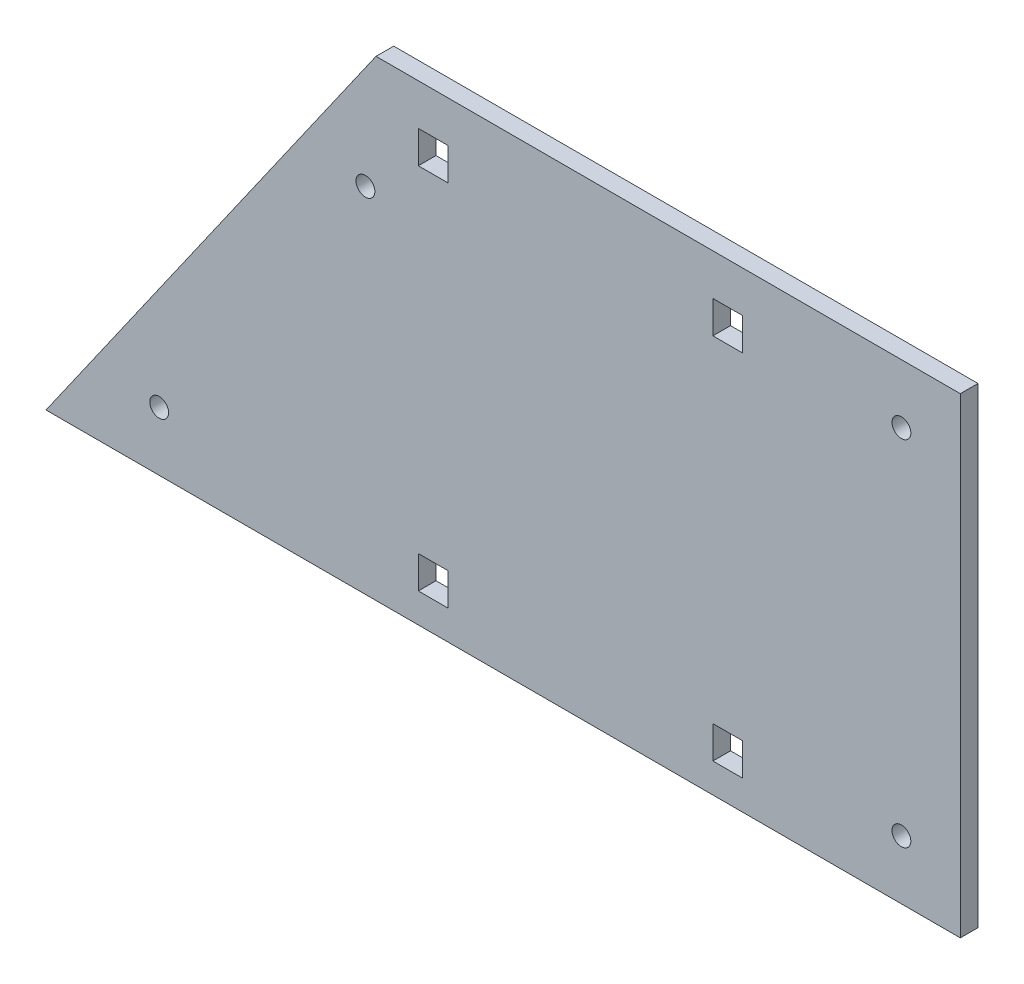
ISO-10303-21;
HEADER;
FILE_DESCRIPTION(('STEP AP214'),'2;1');
FILE_NAME('part.step','',(''),(''),'','','');
FILE_SCHEMA(('AUTOMOTIVE_DESIGN { 1 0 10303 214 1 1 1 1 }'));
ENDSEC;
DATA;
#1=APPLICATION_CONTEXT('core data for automotive mechanical design processes');
#2=APPLICATION_PROTOCOL_DEFINITION('international standard','automotive_design',2000,#1);
#3=PRODUCT_CONTEXT('',#1,'mechanical');
#4=PRODUCT('Part','Part','',(#3));
#5=PRODUCT_RELATED_PRODUCT_CATEGORY('part','',(#4));
#6=PRODUCT_DEFINITION_FORMATION('','',#4);
#7=PRODUCT_DEFINITION_CONTEXT('part definition',#1,'design');
#8=PRODUCT_DEFINITION('design','',#6,#7);
#9=PRODUCT_DEFINITION_SHAPE('','',#8);
#10=(LENGTH_UNIT() NAMED_UNIT(*) SI_UNIT(.MILLI.,.METRE.));
#11=(NAMED_UNIT(*) PLANE_ANGLE_UNIT() SI_UNIT($,.RADIAN.));
#12=(NAMED_UNIT(*) SI_UNIT($,.STERADIAN.) SOLID_ANGLE_UNIT());
#13=UNCERTAINTY_MEASURE_WITH_UNIT(LENGTH_MEASURE(1.E-05),#10,'distance_accuracy_value','');
#14=(GEOMETRIC_REPRESENTATION_CONTEXT(3) GLOBAL_UNCERTAINTY_ASSIGNED_CONTEXT((#13)) GLOBAL_UNIT_ASSIGNED_CONTEXT((#10,
#11,#12)) REPRESENTATION_CONTEXT('',''));
#15=CARTESIAN_POINT('',(0.,0.,0.));
#16=DIRECTION('',(0.,0.,1.));
#17=DIRECTION('',(1.,0.,0.));
#18=AXIS2_PLACEMENT_3D('',#15,#16,#17);
#19=CARTESIAN_POINT('',(0.,0.,3.));
#20=DIRECTION('',(0.,0.,1.));
#21=DIRECTION('',(1.,0.,0.));
#22=AXIS2_PLACEMENT_3D('',#19,#20,#21);
#23=PLANE('',#22);
#24=DIRECTION('',(0.,1.,0.));
#25=VECTOR('',#24,1.);
#26=CARTESIAN_POINT('',(100.749999999974,-37.7500110166151,3.));
#27=LINE('',#26,#25);
#28=CARTESIAN_POINT('',(100.749999999974,-37.7500110166151,3.));
#29=VERTEX_POINT('',#28);
#30=CARTESIAN_POINT('',(100.749999999974,-32.2500110166151,3.));
#31=VERTEX_POINT('',#30);
#32=EDGE_CURVE('E49',#29,#31,#27,.T.);
#33=ORIENTED_EDGE('',*,*,#32,.F.);
#34=DIRECTION('',(1.,0.,0.));
#35=VECTOR('',#34,1.);
#36=CARTESIAN_POINT('',(100.749999999974,-37.7500110166151,3.));
#37=LINE('',#36,#35);
#38=CARTESIAN_POINT('',(95.7499999999737,-37.7500110166151,3.));
#39=VERTEX_POINT('',#38);
#40=EDGE_CURVE('E194',#39,#29,#37,.T.);
#41=ORIENTED_EDGE('',*,*,#40,.F.);
#42=DIRECTION('',(0.,-1.,0.));
#43=VECTOR('',#42,1.);
#44=CARTESIAN_POINT('',(95.7499999999737,-37.7500110166151,3.));
#45=LINE('',#44,#43);
#46=CARTESIAN_POINT('',(95.7499999999737,-32.2500110166151,3.));
#47=VERTEX_POINT('',#46);
#48=EDGE_CURVE('E178',#47,#39,#45,.T.);
#49=ORIENTED_EDGE('',*,*,#48,.F.);
#50=DIRECTION('',(-1.,0.,0.));
#51=VECTOR('',#50,1.);
#52=CARTESIAN_POINT('',(100.749999999974,-32.2500110166151,3.));
#53=LINE('',#52,#51);
#54=EDGE_CURVE('E188',#31,#47,#53,.T.);
#55=ORIENTED_EDGE('',*,*,#54,.F.);
#56=EDGE_LOOP('',(#33,#41,#49,#55));
#57=FACE_BOUND('',#56,.T.);
#58=DIRECTION('',(0.,1.,0.));
#59=VECTOR('',#58,1.);
#60=CARTESIAN_POINT('',(50.7499999999734,-37.750011016615,3.));
#61=LINE('',#60,#59);
#62=CARTESIAN_POINT('',(50.7499999999734,-37.750011016615,3.));
#63=VERTEX_POINT('',#62);
#64=CARTESIAN_POINT('',(50.7499999999734,-32.250011016615,3.));
#65=VERTEX_POINT('',#64);
#66=EDGE_CURVE('E57',#63,#65,#61,.T.);
#67=ORIENTED_EDGE('',*,*,#66,.F.);
#68=DIRECTION('',(1.,0.,0.));
#69=VECTOR('',#68,1.);
#70=CARTESIAN_POINT('',(50.7499999999734,-37.750011016615,3.));
#71=LINE('',#70,#69);
#72=CARTESIAN_POINT('',(45.7499999999735,-37.750011016615,3.));
#73=VERTEX_POINT('',#72);
#74=EDGE_CURVE('E211',#73,#63,#71,.T.);
#75=ORIENTED_EDGE('',*,*,#74,.F.);
#76=DIRECTION('',(0.,-1.,0.));
#77=VECTOR('',#76,1.);
#78=CARTESIAN_POINT('',(45.7499999999735,-37.750011016615,3.));
#79=LINE('',#78,#77);
#80=CARTESIAN_POINT('',(45.7499999999735,-32.250011016615,3.));
#81=VERTEX_POINT('',#80);
#82=EDGE_CURVE('E208',#81,#73,#79,.T.);
#83=ORIENTED_EDGE('',*,*,#82,.F.);
#84=DIRECTION('',(-1.,0.,0.));
#85=VECTOR('',#84,1.);
#86=CARTESIAN_POINT('',(50.7499999999734,-32.250011016615,3.));
#87=LINE('',#86,#85);
#88=EDGE_CURVE('E205',#65,#81,#87,.T.);
#89=ORIENTED_EDGE('',*,*,#88,.F.);
#90=EDGE_LOOP('',(#67,#75,#83,#89));
#91=FACE_BOUND('',#90,.T.);
#92=DIRECTION('',(0.,1.,0.));
#93=VECTOR('',#92,1.);
#94=CARTESIAN_POINT('',(100.749999999971,-100.250011016615,3.));
#95=LINE('',#94,#93);
#96=CARTESIAN_POINT('',(100.749999999971,-100.250011016615,3.));
#97=VERTEX_POINT('',#96);
#98=CARTESIAN_POINT('',(100.749999999971,-94.7500110166151,3.));
#99=VERTEX_POINT('',#98);
#100=EDGE_CURVE('E222',#97,#99,#95,.T.);
#101=ORIENTED_EDGE('',*,*,#100,.F.);
#102=DIRECTION('',(1.,0.,0.));
#103=VECTOR('',#102,1.);
#104=CARTESIAN_POINT('',(100.749999999971,-100.250011016615,3.));
#105=LINE('',#104,#103);
#106=CARTESIAN_POINT('',(95.7499999999711,-100.250011016615,3.));
#107=VERTEX_POINT('',#106);
#108=EDGE_CURVE('E231',#107,#97,#105,.T.);
#109=ORIENTED_EDGE('',*,*,#108,.F.);
#110=DIRECTION('',(0.,-1.,0.));
#111=VECTOR('',#110,1.);
#112=CARTESIAN_POINT('',(95.7499999999711,-100.250011016615,3.));
#113=LINE('',#112,#111);
#114=CARTESIAN_POINT('',(95.7499999999711,-94.7500110166151,3.));
#115=VERTEX_POINT('',#114);
#116=EDGE_CURVE('E228',#115,#107,#113,.T.);
#117=ORIENTED_EDGE('',*,*,#116,.F.);
#118=DIRECTION('',(-1.,0.,0.));
#119=VECTOR('',#118,1.);
#120=CARTESIAN_POINT('',(100.749999999971,-94.7500110166151,3.));
#121=LINE('',#120,#119);
#122=EDGE_CURVE('E224',#99,#115,#121,.T.);
#123=ORIENTED_EDGE('',*,*,#122,.F.);
#124=EDGE_LOOP('',(#101,#109,#117,#123));
#125=FACE_BOUND('',#124,.T.);
#126=DIRECTION('',(0.,1.,0.));
#127=VECTOR('',#126,1.);
#128=CARTESIAN_POINT('',(50.7499999999709,-100.250011016615,3.));
#129=LINE('',#128,#127);
#130=CARTESIAN_POINT('',(50.7499999999709,-100.250011016615,3.));
#131=VERTEX_POINT('',#130);
#132=CARTESIAN_POINT('',(50.7499999999709,-94.750011016615,3.));
#133=VERTEX_POINT('',#132);
#134=EDGE_CURVE('E201',#131,#133,#129,.T.);
#135=ORIENTED_EDGE('',*,*,#134,.F.);
#136=DIRECTION('',(1.,0.,0.));
#137=VECTOR('',#136,1.);
#138=CARTESIAN_POINT('',(50.7499999999709,-100.250011016615,3.));
#139=LINE('',#138,#137);
#140=CARTESIAN_POINT('',(45.749999999971,-100.250011016615,3.));
#141=VERTEX_POINT('',#140);
#142=EDGE_CURVE('E251',#141,#131,#139,.T.);
#143=ORIENTED_EDGE('',*,*,#142,.F.);
#144=DIRECTION('',(0.,-1.,0.));
#145=VECTOR('',#144,1.);
#146=CARTESIAN_POINT('',(45.749999999971,-100.250011016615,3.));
#147=LINE('',#146,#145);
#148=CARTESIAN_POINT('',(45.749999999971,-94.750011016615,3.));
#149=VERTEX_POINT('',#148);
#150=EDGE_CURVE('E248',#149,#141,#147,.T.);
#151=ORIENTED_EDGE('',*,*,#150,.F.);
#152=DIRECTION('',(-1.,0.,0.));
#153=VECTOR('',#152,1.);
#154=CARTESIAN_POINT('',(50.7499999999709,-94.750011016615,3.));
#155=LINE('',#154,#153);
#156=EDGE_CURVE('E245',#133,#149,#155,.T.);
#157=ORIENTED_EDGE('',*,*,#156,.F.);
#158=EDGE_LOOP('',(#135,#143,#151,#157));
#159=FACE_BOUND('',#158,.T.);
#160=CARTESIAN_POINT('',(127.749999999971,-35.25,3.));
#161=DIRECTION('',(0.,0.,1.));
#162=DIRECTION('',(1.,0.,0.));
#163=AXIS2_PLACEMENT_3D('',#160,#161,#162);
#164=CIRCLE('',#163,1.59999999999999);
#165=CARTESIAN_POINT('',(129.349999999971,-35.25,3.));
#166=VERTEX_POINT('',#165);
#167=EDGE_CURVE('E268',#166,#166,#164,.T.);
#168=ORIENTED_EDGE('',*,*,#167,.F.);
#169=EDGE_LOOP('',(#168));
#170=FACE_BOUND('',#169,.T.);
#171=CARTESIAN_POINT('',(36.7735951233743,-45.2500000000001,3.));
#172=DIRECTION('',(0.,0.,1.));
#173=DIRECTION('',(1.,0.,0.));
#174=AXIS2_PLACEMENT_3D('',#171,#172,#173);
#175=CIRCLE('',#174,1.6);
#176=CARTESIAN_POINT('',(38.3735951233743,-45.2500000000001,3.));
#177=VERTEX_POINT('',#176);
#178=EDGE_CURVE('E280',#177,#177,#175,.T.);
#179=ORIENTED_EDGE('',*,*,#178,.F.);
#180=EDGE_LOOP('',(#179));
#181=FACE_BOUND('',#180,.T.);
#182=DIRECTION('',(0.,1.,0.));
#183=VECTOR('',#182,1.);
#184=CARTESIAN_POINT('',(137.749999999971,-25.25,3.));
#185=LINE('',#184,#183);
#186=CARTESIAN_POINT('',(137.749999999968,-105.25,3.));
#187=VERTEX_POINT('',#186);
#188=CARTESIAN_POINT('',(137.749999999971,-25.25,3.));
#189=VERTEX_POINT('',#188);
#190=EDGE_CURVE('E286',#187,#189,#185,.T.);
#191=ORIENTED_EDGE('',*,*,#190,.T.);
#192=DIRECTION('',(-1.,0.,0.));
#193=VECTOR('',#192,1.);
#194=CARTESIAN_POINT('',(137.749999999971,-25.25,3.));
#195=LINE('',#194,#193);
#196=CARTESIAN_POINT('',(38.569999999954,-25.25,3.));
#197=VERTEX_POINT('',#196);
#198=EDGE_CURVE('E289',#189,#197,#195,.T.);
#199=ORIENTED_EDGE('',*,*,#198,.T.);
#200=DIRECTION('',(-0.573576436351044,-0.819152044288993,0.));
#201=VECTOR('',#200,1.);
#202=CARTESIAN_POINT('',(38.569999999954,-25.25,3.));
#203=LINE('',#202,#201);
#204=CARTESIAN_POINT('',(-17.4466030568225,-105.25,3.));
#205=VERTEX_POINT('',#204);
#206=EDGE_CURVE('E292',#197,#205,#203,.T.);
#207=ORIENTED_EDGE('',*,*,#206,.T.);
#208=DIRECTION('',(1.,0.,0.));
#209=VECTOR('',#208,1.);
#210=CARTESIAN_POINT('',(-17.4466030568225,-105.25,3.));
#211=LINE('',#210,#209);
#212=EDGE_CURVE('E294',#205,#187,#211,.T.);
#213=ORIENTED_EDGE('',*,*,#212,.T.);
#214=EDGE_LOOP('',(#191,#199,#207,#213));
#215=FACE_BOUND('',#214,.T.);
#216=CARTESIAN_POINT('',(1.76321821288909,-95.25,3.));
#217=DIRECTION('',(0.,0.,1.));
#218=DIRECTION('',(1.,0.,0.));
#219=AXIS2_PLACEMENT_3D('',#216,#217,#218);
#220=CIRCLE('',#219,1.60000000000001);
#221=CARTESIAN_POINT('',(3.36321821288909,-95.25,3.));
#222=VERTEX_POINT('',#221);
#223=EDGE_CURVE('E274',#222,#222,#220,.T.);
#224=ORIENTED_EDGE('',*,*,#223,.F.);
#225=EDGE_LOOP('',(#224));
#226=FACE_BOUND('',#225,.T.);
#227=CARTESIAN_POINT('',(127.749999999971,-95.25,3.));
#228=DIRECTION('',(0.,0.,1.));
#229=DIRECTION('',(1.,0.,0.));
#230=AXIS2_PLACEMENT_3D('',#227,#228,#229);
#231=CIRCLE('',#230,1.59999999999999);
#232=CARTESIAN_POINT('',(129.349999999971,-95.25,3.));
#233=VERTEX_POINT('',#232);
#234=EDGE_CURVE('E262',#233,#233,#231,.T.);
#235=ORIENTED_EDGE('',*,*,#234,.F.);
#236=EDGE_LOOP('',(#235));
#237=FACE_BOUND('',#236,.T.);
#238=ADVANCED_FACE('F34',(#57,#91,#125,#159,#170,#181,#215,#226,#237),#23,.T.);
#239=CARTESIAN_POINT('',(0.,0.,0.));
#240=DIRECTION('',(0.,0.,1.));
#241=DIRECTION('',(1.,0.,0.));
#242=AXIS2_PLACEMENT_3D('',#239,#240,#241);
#243=PLANE('',#242);
#244=DIRECTION('',(1.,0.,0.));
#245=VECTOR('',#244,1.);
#246=CARTESIAN_POINT('',(0.,-37.7500110166151,0.));
#247=LINE('',#246,#245);
#248=CARTESIAN_POINT('',(95.7499999999737,-37.7500110166151,0.));
#249=VERTEX_POINT('',#248);
#250=CARTESIAN_POINT('',(100.749999999974,-37.7500110166151,0.));
#251=VERTEX_POINT('',#250);
#252=EDGE_CURVE('E42',#249,#251,#247,.T.);
#253=ORIENTED_EDGE('',*,*,#252,.T.);
#254=DIRECTION('',(0.,1.,0.));
#255=VECTOR('',#254,1.);
#256=CARTESIAN_POINT('',(100.749999999974,0.,0.));
#257=LINE('',#256,#255);
#258=CARTESIAN_POINT('',(100.749999999974,-32.2500110166151,0.));
#259=VERTEX_POINT('',#258);
#260=EDGE_CURVE('E11',#251,#259,#257,.T.);
#261=ORIENTED_EDGE('',*,*,#260,.T.);
#262=DIRECTION('',(-1.,0.,0.));
#263=VECTOR('',#262,1.);
#264=CARTESIAN_POINT('',(0.,-32.2500110166151,0.));
#265=LINE('',#264,#263);
#266=CARTESIAN_POINT('',(95.7499999999737,-32.2500110166151,0.));
#267=VERTEX_POINT('',#266);
#268=EDGE_CURVE('E351',#259,#267,#265,.T.);
#269=ORIENTED_EDGE('',*,*,#268,.T.);
#270=DIRECTION('',(0.,-1.,0.));
#271=VECTOR('',#270,1.);
#272=CARTESIAN_POINT('',(95.7499999999737,0.,0.));
#273=LINE('',#272,#271);
#274=EDGE_CURVE('E181',#267,#249,#273,.T.);
#275=ORIENTED_EDGE('',*,*,#274,.T.);
#276=EDGE_LOOP('',(#253,#261,#269,#275));
#277=FACE_BOUND('',#276,.T.);
#278=DIRECTION('',(1.,0.,0.));
#279=VECTOR('',#278,1.);
#280=CARTESIAN_POINT('',(0.,-37.750011016615,0.));
#281=LINE('',#280,#279);
#282=CARTESIAN_POINT('',(45.7499999999735,-37.750011016615,0.));
#283=VERTEX_POINT('',#282);
#284=CARTESIAN_POINT('',(50.7499999999734,-37.750011016615,0.));
#285=VERTEX_POINT('',#284);
#286=EDGE_CURVE('E345',#283,#285,#281,.T.);
#287=ORIENTED_EDGE('',*,*,#286,.T.);
#288=DIRECTION('',(0.,1.,0.));
#289=VECTOR('',#288,1.);
#290=CARTESIAN_POINT('',(50.7499999999734,0.,0.));
#291=LINE('',#290,#289);
#292=CARTESIAN_POINT('',(50.7499999999734,-32.250011016615,0.));
#293=VERTEX_POINT('',#292);
#294=EDGE_CURVE('E348',#285,#293,#291,.T.);
#295=ORIENTED_EDGE('',*,*,#294,.T.);
#296=DIRECTION('',(-1.,0.,0.));
#297=VECTOR('',#296,1.);
#298=CARTESIAN_POINT('',(0.,-32.250011016615,0.));
#299=LINE('',#298,#297);
#300=CARTESIAN_POINT('',(45.7499999999735,-32.250011016615,0.));
#301=VERTEX_POINT('',#300);
#302=EDGE_CURVE('E339',#293,#301,#299,.T.);
#303=ORIENTED_EDGE('',*,*,#302,.T.);
#304=DIRECTION('',(0.,-1.,0.));
#305=VECTOR('',#304,1.);
#306=CARTESIAN_POINT('',(45.7499999999735,0.,0.));
#307=LINE('',#306,#305);
#308=EDGE_CURVE('E342',#301,#283,#307,.T.);
#309=ORIENTED_EDGE('',*,*,#308,.T.);
#310=EDGE_LOOP('',(#287,#295,#303,#309));
#311=FACE_BOUND('',#310,.T.);
#312=DIRECTION('',(1.,0.,0.));
#313=VECTOR('',#312,1.);
#314=CARTESIAN_POINT('',(0.,-100.250011016615,0.));
#315=LINE('',#314,#313);
#316=CARTESIAN_POINT('',(95.7499999999711,-100.250011016615,0.));
#317=VERTEX_POINT('',#316);
#318=CARTESIAN_POINT('',(100.749999999971,-100.250011016615,0.));
#319=VERTEX_POINT('',#318);
#320=EDGE_CURVE('E333',#317,#319,#315,.T.);
#321=ORIENTED_EDGE('',*,*,#320,.T.);
#322=DIRECTION('',(0.,1.,0.));
#323=VECTOR('',#322,1.);
#324=CARTESIAN_POINT('',(100.749999999971,0.,0.));
#325=LINE('',#324,#323);
#326=CARTESIAN_POINT('',(100.749999999971,-94.7500110166151,0.));
#327=VERTEX_POINT('',#326);
#328=EDGE_CURVE('E336',#319,#327,#325,.T.);
#329=ORIENTED_EDGE('',*,*,#328,.T.);
#330=DIRECTION('',(-1.,0.,0.));
#331=VECTOR('',#330,1.);
#332=CARTESIAN_POINT('',(0.,-94.7500110166151,0.));
#333=LINE('',#332,#331);
#334=CARTESIAN_POINT('',(95.7499999999711,-94.7500110166151,0.));
#335=VERTEX_POINT('',#334);
#336=EDGE_CURVE('E327',#327,#335,#333,.T.);
#337=ORIENTED_EDGE('',*,*,#336,.T.);
#338=DIRECTION('',(0.,-1.,0.));
#339=VECTOR('',#338,1.);
#340=CARTESIAN_POINT('',(95.7499999999711,0.,0.));
#341=LINE('',#340,#339);
#342=EDGE_CURVE('E330',#335,#317,#341,.T.);
#343=ORIENTED_EDGE('',*,*,#342,.T.);
#344=EDGE_LOOP('',(#321,#329,#337,#343));
#345=FACE_BOUND('',#344,.T.);
#346=DIRECTION('',(1.,0.,0.));
#347=VECTOR('',#346,1.);
#348=CARTESIAN_POINT('',(0.,-100.250011016615,0.));
#349=LINE('',#348,#347);
#350=CARTESIAN_POINT('',(45.749999999971,-100.250011016615,0.));
#351=VERTEX_POINT('',#350);
#352=CARTESIAN_POINT('',(50.7499999999709,-100.250011016615,0.));
#353=VERTEX_POINT('',#352);
#354=EDGE_CURVE('E321',#351,#353,#349,.T.);
#355=ORIENTED_EDGE('',*,*,#354,.T.);
#356=DIRECTION('',(0.,1.,0.));
#357=VECTOR('',#356,1.);
#358=CARTESIAN_POINT('',(50.7499999999709,0.,0.));
#359=LINE('',#358,#357);
#360=CARTESIAN_POINT('',(50.7499999999709,-94.750011016615,0.));
#361=VERTEX_POINT('',#360);
#362=EDGE_CURVE('E324',#353,#361,#359,.T.);
#363=ORIENTED_EDGE('',*,*,#362,.T.);
#364=DIRECTION('',(-1.,0.,0.));
#365=VECTOR('',#364,1.);
#366=CARTESIAN_POINT('',(0.,-94.750011016615,0.));
#367=LINE('',#366,#365);
#368=CARTESIAN_POINT('',(45.749999999971,-94.750011016615,0.));
#369=VERTEX_POINT('',#368);
#370=EDGE_CURVE('E315',#361,#369,#367,.T.);
#371=ORIENTED_EDGE('',*,*,#370,.T.);
#372=DIRECTION('',(0.,-1.,0.));
#373=VECTOR('',#372,1.);
#374=CARTESIAN_POINT('',(45.749999999971,0.,0.));
#375=LINE('',#374,#373);
#376=EDGE_CURVE('E318',#369,#351,#375,.T.);
#377=ORIENTED_EDGE('',*,*,#376,.T.);
#378=EDGE_LOOP('',(#355,#363,#371,#377));
#379=FACE_BOUND('',#378,.T.);
#380=DIRECTION('',(0.,1.,0.));
#381=VECTOR('',#380,1.);
#382=CARTESIAN_POINT('',(137.749999999971,-25.25,0.));
#383=LINE('',#382,#381);
#384=CARTESIAN_POINT('',(137.749999999968,-105.25,0.));
#385=VERTEX_POINT('',#384);
#386=CARTESIAN_POINT('',(137.749999999971,-25.25,0.));
#387=VERTEX_POINT('',#386);
#388=EDGE_CURVE('E283',#385,#387,#383,.T.);
#389=ORIENTED_EDGE('',*,*,#388,.F.);
#390=DIRECTION('',(1.,0.,0.));
#391=VECTOR('',#390,1.);
#392=CARTESIAN_POINT('',(-17.4466030568225,-105.25,0.));
#393=LINE('',#392,#391);
#394=CARTESIAN_POINT('',(-17.4466030568225,-105.25,0.));
#395=VERTEX_POINT('',#394);
#396=EDGE_CURVE('E290',#395,#385,#393,.T.);
#397=ORIENTED_EDGE('',*,*,#396,.F.);
#398=DIRECTION('',(-0.573576436351044,-0.819152044288993,0.));
#399=VECTOR('',#398,1.);
#400=CARTESIAN_POINT('',(38.569999999954,-25.25,0.));
#401=LINE('',#400,#399);
#402=CARTESIAN_POINT('',(38.569999999954,-25.25,0.));
#403=VERTEX_POINT('',#402);
#404=EDGE_CURVE('E301',#403,#395,#401,.T.);
#405=ORIENTED_EDGE('',*,*,#404,.F.);
#406=DIRECTION('',(-1.,0.,0.));
#407=VECTOR('',#406,1.);
#408=CARTESIAN_POINT('',(137.749999999971,-25.25,0.));
#409=LINE('',#408,#407);
#410=EDGE_CURVE('E299',#387,#403,#409,.T.);
#411=ORIENTED_EDGE('',*,*,#410,.F.);
#412=EDGE_LOOP('',(#389,#397,#405,#411));
#413=FACE_BOUND('',#412,.T.);
#414=CARTESIAN_POINT('',(36.7735951233743,-45.2500000000001,0.));
#415=DIRECTION('',(0.,0.,1.));
#416=DIRECTION('',(1.,0.,0.));
#417=AXIS2_PLACEMENT_3D('',#414,#415,#416);
#418=CIRCLE('',#417,1.6);
#419=CARTESIAN_POINT('',(38.3735951233743,-45.2500000000001,0.));
#420=VERTEX_POINT('',#419);
#421=EDGE_CURVE('E277',#420,#420,#418,.T.);
#422=ORIENTED_EDGE('',*,*,#421,.T.);
#423=EDGE_LOOP('',(#422));
#424=FACE_BOUND('',#423,.T.);
#425=CARTESIAN_POINT('',(1.76321821288909,-95.25,0.));
#426=DIRECTION('',(0.,0.,1.));
#427=DIRECTION('',(1.,0.,0.));
#428=AXIS2_PLACEMENT_3D('',#425,#426,#427);
#429=CIRCLE('',#428,1.60000000000001);
#430=CARTESIAN_POINT('',(3.36321821288909,-95.25,0.));
#431=VERTEX_POINT('',#430);
#432=EDGE_CURVE('E271',#431,#431,#429,.T.);
#433=ORIENTED_EDGE('',*,*,#432,.T.);
#434=EDGE_LOOP('',(#433));
#435=FACE_BOUND('',#434,.T.);
#436=CARTESIAN_POINT('',(127.749999999971,-35.25,0.));
#437=DIRECTION('',(0.,0.,1.));
#438=DIRECTION('',(1.,0.,0.));
#439=AXIS2_PLACEMENT_3D('',#436,#437,#438);
#440=CIRCLE('',#439,1.59999999999999);
#441=CARTESIAN_POINT('',(129.349999999971,-35.25,0.));
#442=VERTEX_POINT('',#441);
#443=EDGE_CURVE('E265',#442,#442,#440,.T.);
#444=ORIENTED_EDGE('',*,*,#443,.T.);
#445=EDGE_LOOP('',(#444));
#446=FACE_BOUND('',#445,.T.);
#447=CARTESIAN_POINT('',(127.749999999971,-95.25,0.));
#448=DIRECTION('',(0.,0.,1.));
#449=DIRECTION('',(1.,0.,0.));
#450=AXIS2_PLACEMENT_3D('',#447,#448,#449);
#451=CIRCLE('',#450,1.59999999999999);
#452=CARTESIAN_POINT('',(129.349999999971,-95.25,0.));
#453=VERTEX_POINT('',#452);
#454=EDGE_CURVE('E237',#453,#453,#451,.T.);
#455=ORIENTED_EDGE('',*,*,#454,.T.);
#456=EDGE_LOOP('',(#455));
#457=FACE_BOUND('',#456,.T.);
#458=ADVANCED_FACE('F355',(#277,#311,#345,#379,#413,#424,#435,#446,#457),#243,.F.);
#459=CARTESIAN_POINT('',(137.749999999971,-25.25,3.));
#460=DIRECTION('',(-1.,0.,0.));
#461=DIRECTION('',(0.,-1.,0.));
#462=AXIS2_PLACEMENT_3D('',#459,#460,#461);
#463=PLANE('',#462);
#464=ORIENTED_EDGE('',*,*,#388,.T.);
#465=DIRECTION('',(0.,0.,-1.));
#466=VECTOR('',#465,1.);
#467=CARTESIAN_POINT('',(137.749999999971,-25.25,3.));
#468=LINE('',#467,#466);
#469=EDGE_CURVE('E312',#189,#387,#468,.T.);
#470=ORIENTED_EDGE('',*,*,#469,.F.);
#471=ORIENTED_EDGE('',*,*,#190,.F.);
#472=DIRECTION('',(0.,0.,-1.));
#473=VECTOR('',#472,1.);
#474=CARTESIAN_POINT('',(137.749999999968,-105.25,3.));
#475=LINE('',#474,#473);
#476=EDGE_CURVE('E296',#187,#385,#475,.T.);
#477=ORIENTED_EDGE('',*,*,#476,.T.);
#478=EDGE_LOOP('',(#464,#470,#471,#477));
#479=FACE_BOUND('',#478,.T.);
#480=ADVANCED_FACE('F36',(#479),#463,.F.);
#481=CARTESIAN_POINT('',(137.749999999971,-25.25,3.));
#482=DIRECTION('',(0.,-1.,0.));
#483=DIRECTION('',(0.,0.,-1.));
#484=AXIS2_PLACEMENT_3D('',#481,#482,#483);
#485=PLANE('',#484);
#486=ORIENTED_EDGE('',*,*,#410,.T.);
#487=DIRECTION('',(0.,0.,-1.));
#488=VECTOR('',#487,1.);
#489=CARTESIAN_POINT('',(38.569999999954,-25.25,3.));
#490=LINE('',#489,#488);
#491=EDGE_CURVE('E309',#197,#403,#490,.T.);
#492=ORIENTED_EDGE('',*,*,#491,.F.);
#493=ORIENTED_EDGE('',*,*,#198,.F.);
#494=ORIENTED_EDGE('',*,*,#469,.T.);
#495=EDGE_LOOP('',(#486,#492,#493,#494));
#496=FACE_BOUND('',#495,.T.);
#497=ADVANCED_FACE('F391',(#496),#485,.F.);
#498=CARTESIAN_POINT('',(38.569999999954,-25.25,3.));
#499=DIRECTION('',(0.819152044288993,-0.573576436351044,0.));
#500=DIRECTION('',(0.573576436351044,0.819152044288994,0.));
#501=AXIS2_PLACEMENT_3D('',#498,#499,#500);
#502=PLANE('',#501);
#503=ORIENTED_EDGE('',*,*,#404,.T.);
#504=DIRECTION('',(0.,0.,-1.));
#505=VECTOR('',#504,1.);
#506=CARTESIAN_POINT('',(-17.4466030568225,-105.25,3.));
#507=LINE('',#506,#505);
#508=EDGE_CURVE('E306',#205,#395,#507,.T.);
#509=ORIENTED_EDGE('',*,*,#508,.F.);
#510=ORIENTED_EDGE('',*,*,#206,.F.);
#511=ORIENTED_EDGE('',*,*,#491,.T.);
#512=EDGE_LOOP('',(#503,#509,#510,#511));
#513=FACE_BOUND('',#512,.T.);
#514=ADVANCED_FACE('F388',(#513),#502,.F.);
#515=CARTESIAN_POINT('',(-17.4466030568225,-105.25,3.));
#516=DIRECTION('',(0.,1.,0.));
#517=DIRECTION('',(0.,0.,1.));
#518=AXIS2_PLACEMENT_3D('',#515,#516,#517);
#519=PLANE('',#518);
#520=ORIENTED_EDGE('',*,*,#396,.T.);
#521=ORIENTED_EDGE('',*,*,#476,.F.);
#522=ORIENTED_EDGE('',*,*,#212,.F.);
#523=ORIENTED_EDGE('',*,*,#508,.T.);
#524=EDGE_LOOP('',(#520,#521,#522,#523));
#525=FACE_BOUND('',#524,.T.);
#526=ADVANCED_FACE('F385',(#525),#519,.F.);
#527=CARTESIAN_POINT('',(36.7735951233743,-45.2500000000001,3.));
#528=DIRECTION('',(0.,0.,-1.));
#529=DIRECTION('',(-1.,0.,0.));
#530=AXIS2_PLACEMENT_3D('',#527,#528,#529);
#531=CYLINDRICAL_SURFACE('',#530,1.6);
#532=ORIENTED_EDGE('',*,*,#178,.T.);
#533=EDGE_LOOP('',(#532));
#534=FACE_BOUND('',#533,.T.);
#535=ORIENTED_EDGE('',*,*,#421,.F.);
#536=EDGE_LOOP('',(#535));
#537=FACE_BOUND('',#536,.T.);
#538=ADVANCED_FACE('F382',(#534,#537),#531,.F.);
#539=CARTESIAN_POINT('',(1.76321821288909,-95.25,3.));
#540=DIRECTION('',(0.,0.,-1.));
#541=DIRECTION('',(-1.,0.,0.));
#542=AXIS2_PLACEMENT_3D('',#539,#540,#541);
#543=CYLINDRICAL_SURFACE('',#542,1.60000000000001);
#544=ORIENTED_EDGE('',*,*,#223,.T.);
#545=EDGE_LOOP('',(#544));
#546=FACE_BOUND('',#545,.T.);
#547=ORIENTED_EDGE('',*,*,#432,.F.);
#548=EDGE_LOOP('',(#547));
#549=FACE_BOUND('',#548,.T.);
#550=ADVANCED_FACE('F432',(#546,#549),#543,.F.);
#551=CARTESIAN_POINT('',(127.749999999971,-35.25,3.));
#552=DIRECTION('',(0.,0.,-1.));
#553=DIRECTION('',(-1.,0.,0.));
#554=AXIS2_PLACEMENT_3D('',#551,#552,#553);
#555=CYLINDRICAL_SURFACE('',#554,1.59999999999999);
#556=ORIENTED_EDGE('',*,*,#167,.T.);
#557=EDGE_LOOP('',(#556));
#558=FACE_BOUND('',#557,.T.);
#559=ORIENTED_EDGE('',*,*,#443,.F.);
#560=EDGE_LOOP('',(#559));
#561=FACE_BOUND('',#560,.T.);
#562=ADVANCED_FACE('F421',(#558,#561),#555,.F.);
#563=CARTESIAN_POINT('',(127.749999999971,-95.25,3.));
#564=DIRECTION('',(0.,0.,-1.));
#565=DIRECTION('',(-1.,0.,0.));
#566=AXIS2_PLACEMENT_3D('',#563,#564,#565);
#567=CYLINDRICAL_SURFACE('',#566,1.59999999999999);
#568=ORIENTED_EDGE('',*,*,#234,.T.);
#569=EDGE_LOOP('',(#568));
#570=FACE_BOUND('',#569,.T.);
#571=ORIENTED_EDGE('',*,*,#454,.F.);
#572=EDGE_LOOP('',(#571));
#573=FACE_BOUND('',#572,.T.);
#574=ADVANCED_FACE('F417',(#570,#573),#567,.F.);
#575=CARTESIAN_POINT('',(50.7499999999709,-100.250011016615,-2.));
#576=DIRECTION('',(1.,0.,0.));
#577=DIRECTION('',(0.,0.,-1.));
#578=AXIS2_PLACEMENT_3D('',#575,#576,#577);
#579=PLANE('',#578);
#580=DIRECTION('',(0.,0.,1.));
#581=VECTOR('',#580,1.);
#582=CARTESIAN_POINT('',(50.7499999999709,-100.250011016615,-2.));
#583=LINE('',#582,#581);
#584=EDGE_CURVE('E225',#353,#131,#583,.T.);
#585=ORIENTED_EDGE('',*,*,#584,.T.);
#586=ORIENTED_EDGE('',*,*,#134,.T.);
#587=DIRECTION('',(0.,0.,1.));
#588=VECTOR('',#587,1.);
#589=CARTESIAN_POINT('',(50.7499999999709,-94.750011016615,-2.));
#590=LINE('',#589,#588);
#591=EDGE_CURVE('E254',#361,#133,#590,.T.);
#592=ORIENTED_EDGE('',*,*,#591,.F.);
#593=ORIENTED_EDGE('',*,*,#362,.F.);
#594=EDGE_LOOP('',(#585,#586,#592,#593));
#595=FACE_BOUND('',#594,.T.);
#596=ADVANCED_FACE('F420',(#595),#579,.F.);
#597=CARTESIAN_POINT('',(50.7499999999709,-100.250011016615,-2.));
#598=DIRECTION('',(0.,-1.,0.));
#599=DIRECTION('',(0.,0.,-1.));
#600=AXIS2_PLACEMENT_3D('',#597,#598,#599);
#601=PLANE('',#600);
#602=DIRECTION('',(0.,0.,1.));
#603=VECTOR('',#602,1.);
#604=CARTESIAN_POINT('',(45.749999999971,-100.250011016615,-2.));
#605=LINE('',#604,#603);
#606=EDGE_CURVE('E256',#351,#141,#605,.T.);
#607=ORIENTED_EDGE('',*,*,#606,.T.);
#608=ORIENTED_EDGE('',*,*,#142,.T.);
#609=ORIENTED_EDGE('',*,*,#584,.F.);
#610=ORIENTED_EDGE('',*,*,#354,.F.);
#611=EDGE_LOOP('',(#607,#608,#609,#610));
#612=FACE_BOUND('',#611,.T.);
#613=ADVANCED_FACE('F429',(#612),#601,.F.);
#614=CARTESIAN_POINT('',(45.749999999971,-100.250011016615,-2.));
#615=DIRECTION('',(-1.,0.,0.));
#616=DIRECTION('',(0.,0.,1.));
#617=AXIS2_PLACEMENT_3D('',#614,#615,#616);
#618=PLANE('',#617);
#619=DIRECTION('',(0.,0.,1.));
#620=VECTOR('',#619,1.);
#621=CARTESIAN_POINT('',(45.749999999971,-94.750011016615,-2.));
#622=LINE('',#621,#620);
#623=EDGE_CURVE('E258',#369,#149,#622,.T.);
#624=ORIENTED_EDGE('',*,*,#623,.T.);
#625=ORIENTED_EDGE('',*,*,#150,.T.);
#626=ORIENTED_EDGE('',*,*,#606,.F.);
#627=ORIENTED_EDGE('',*,*,#376,.F.);
#628=EDGE_LOOP('',(#624,#625,#626,#627));
#629=FACE_BOUND('',#628,.T.);
#630=ADVANCED_FACE('F565',(#629),#618,.F.);
#631=CARTESIAN_POINT('',(50.7499999999709,-94.750011016615,-2.));
#632=DIRECTION('',(0.,1.,0.));
#633=DIRECTION('',(0.,0.,1.));
#634=AXIS2_PLACEMENT_3D('',#631,#632,#633);
#635=PLANE('',#634);
#636=ORIENTED_EDGE('',*,*,#591,.T.);
#637=ORIENTED_EDGE('',*,*,#156,.T.);
#638=ORIENTED_EDGE('',*,*,#623,.F.);
#639=ORIENTED_EDGE('',*,*,#370,.F.);
#640=EDGE_LOOP('',(#636,#637,#638,#639));
#641=FACE_BOUND('',#640,.T.);
#642=ADVANCED_FACE('F561',(#641),#635,.F.);
#643=CARTESIAN_POINT('',(100.749999999971,-100.250011016615,-2.));
#644=DIRECTION('',(1.,0.,0.));
#645=DIRECTION('',(0.,0.,-1.));
#646=AXIS2_PLACEMENT_3D('',#643,#644,#645);
#647=PLANE('',#646);
#648=DIRECTION('',(0.,0.,1.));
#649=VECTOR('',#648,1.);
#650=CARTESIAN_POINT('',(100.749999999971,-100.250011016615,-2.));
#651=LINE('',#650,#649);
#652=EDGE_CURVE('E235',#319,#97,#651,.T.);
#653=ORIENTED_EDGE('',*,*,#652,.T.);
#654=ORIENTED_EDGE('',*,*,#100,.T.);
#655=DIRECTION('',(0.,0.,1.));
#656=VECTOR('',#655,1.);
#657=CARTESIAN_POINT('',(100.749999999971,-94.7500110166151,-2.));
#658=LINE('',#657,#656);
#659=EDGE_CURVE('E234',#327,#99,#658,.T.);
#660=ORIENTED_EDGE('',*,*,#659,.F.);
#661=ORIENTED_EDGE('',*,*,#328,.F.);
#662=EDGE_LOOP('',(#653,#654,#660,#661));
#663=FACE_BOUND('',#662,.T.);
#664=ADVANCED_FACE('F552',(#663),#647,.F.);
#665=CARTESIAN_POINT('',(100.749999999971,-100.250011016615,-2.));
#666=DIRECTION('',(0.,-1.,0.));
#667=DIRECTION('',(0.,0.,-1.));
#668=AXIS2_PLACEMENT_3D('',#665,#666,#667);
#669=PLANE('',#668);
#670=DIRECTION('',(0.,0.,1.));
#671=VECTOR('',#670,1.);
#672=CARTESIAN_POINT('',(95.7499999999711,-100.250011016615,-2.));
#673=LINE('',#672,#671);
#674=EDGE_CURVE('E238',#317,#107,#673,.T.);
#675=ORIENTED_EDGE('',*,*,#674,.T.);
#676=ORIENTED_EDGE('',*,*,#108,.T.);
#677=ORIENTED_EDGE('',*,*,#652,.F.);
#678=ORIENTED_EDGE('',*,*,#320,.F.);
#679=EDGE_LOOP('',(#675,#676,#677,#678));
#680=FACE_BOUND('',#679,.T.);
#681=ADVANCED_FACE('F548',(#680),#669,.F.);
#682=CARTESIAN_POINT('',(95.7499999999711,-100.250011016615,-2.));
#683=DIRECTION('',(-1.,0.,0.));
#684=DIRECTION('',(0.,0.,1.));
#685=AXIS2_PLACEMENT_3D('',#682,#683,#684);
#686=PLANE('',#685);
#687=DIRECTION('',(0.,0.,1.));
#688=VECTOR('',#687,1.);
#689=CARTESIAN_POINT('',(95.7499999999711,-94.7500110166151,-2.));
#690=LINE('',#689,#688);
#691=EDGE_CURVE('E240',#335,#115,#690,.T.);
#692=ORIENTED_EDGE('',*,*,#691,.T.);
#693=ORIENTED_EDGE('',*,*,#116,.T.);
#694=ORIENTED_EDGE('',*,*,#674,.F.);
#695=ORIENTED_EDGE('',*,*,#342,.F.);
#696=EDGE_LOOP('',(#692,#693,#694,#695));
#697=FACE_BOUND('',#696,.T.);
#698=ADVANCED_FACE('F551',(#697),#686,.F.);
#699=CARTESIAN_POINT('',(100.749999999971,-94.7500110166151,-2.));
#700=DIRECTION('',(0.,1.,0.));
#701=DIRECTION('',(0.,0.,1.));
#702=AXIS2_PLACEMENT_3D('',#699,#700,#701);
#703=PLANE('',#702);
#704=ORIENTED_EDGE('',*,*,#659,.T.);
#705=ORIENTED_EDGE('',*,*,#122,.T.);
#706=ORIENTED_EDGE('',*,*,#691,.F.);
#707=ORIENTED_EDGE('',*,*,#336,.F.);
#708=EDGE_LOOP('',(#704,#705,#706,#707));
#709=FACE_BOUND('',#708,.T.);
#710=ADVANCED_FACE('F493',(#709),#703,.F.);
#711=CARTESIAN_POINT('',(50.7499999999734,-37.750011016615,-2.));
#712=DIRECTION('',(1.,0.,0.));
#713=DIRECTION('',(0.,0.,-1.));
#714=AXIS2_PLACEMENT_3D('',#711,#712,#713);
#715=PLANE('',#714);
#716=DIRECTION('',(0.,0.,1.));
#717=VECTOR('',#716,1.);
#718=CARTESIAN_POINT('',(50.7499999999734,-37.750011016615,-2.));
#719=LINE('',#718,#717);
#720=EDGE_CURVE('E215',#285,#63,#719,.T.);
#721=ORIENTED_EDGE('',*,*,#720,.T.);
#722=ORIENTED_EDGE('',*,*,#66,.T.);
#723=DIRECTION('',(0.,0.,1.));
#724=VECTOR('',#723,1.);
#725=CARTESIAN_POINT('',(50.7499999999734,-32.250011016615,-2.));
#726=LINE('',#725,#724);
#727=EDGE_CURVE('E214',#293,#65,#726,.T.);
#728=ORIENTED_EDGE('',*,*,#727,.F.);
#729=ORIENTED_EDGE('',*,*,#294,.F.);
#730=EDGE_LOOP('',(#721,#722,#728,#729));
#731=FACE_BOUND('',#730,.T.);
#732=ADVANCED_FACE('F487',(#731),#715,.F.);
#733=CARTESIAN_POINT('',(50.7499999999734,-37.750011016615,-2.));
#734=DIRECTION('',(0.,-1.,0.));
#735=DIRECTION('',(0.,0.,-1.));
#736=AXIS2_PLACEMENT_3D('',#733,#734,#735);
#737=PLANE('',#736);
#738=DIRECTION('',(0.,0.,1.));
#739=VECTOR('',#738,1.);
#740=CARTESIAN_POINT('',(45.7499999999735,-37.750011016615,-2.));
#741=LINE('',#740,#739);
#742=EDGE_CURVE('E217',#283,#73,#741,.T.);
#743=ORIENTED_EDGE('',*,*,#742,.T.);
#744=ORIENTED_EDGE('',*,*,#74,.T.);
#745=ORIENTED_EDGE('',*,*,#720,.F.);
#746=ORIENTED_EDGE('',*,*,#286,.F.);
#747=EDGE_LOOP('',(#743,#744,#745,#746));
#748=FACE_BOUND('',#747,.T.);
#749=ADVANCED_FACE('F492',(#748),#737,.F.);
#750=CARTESIAN_POINT('',(45.7499999999735,-37.750011016615,-2.));
#751=DIRECTION('',(-1.,0.,0.));
#752=DIRECTION('',(0.,0.,1.));
#753=AXIS2_PLACEMENT_3D('',#750,#751,#752);
#754=PLANE('',#753);
#755=DIRECTION('',(0.,0.,1.));
#756=VECTOR('',#755,1.);
#757=CARTESIAN_POINT('',(45.7499999999735,-32.250011016615,-2.));
#758=LINE('',#757,#756);
#759=EDGE_CURVE('E219',#301,#81,#758,.T.);
#760=ORIENTED_EDGE('',*,*,#759,.T.);
#761=ORIENTED_EDGE('',*,*,#82,.T.);
#762=ORIENTED_EDGE('',*,*,#742,.F.);
#763=ORIENTED_EDGE('',*,*,#308,.F.);
#764=EDGE_LOOP('',(#760,#761,#762,#763));
#765=FACE_BOUND('',#764,.T.);
#766=ADVANCED_FACE('F369',(#765),#754,.F.);
#767=CARTESIAN_POINT('',(50.7499999999734,-32.250011016615,-2.));
#768=DIRECTION('',(0.,1.,0.));
#769=DIRECTION('',(0.,0.,1.));
#770=AXIS2_PLACEMENT_3D('',#767,#768,#769);
#771=PLANE('',#770);
#772=ORIENTED_EDGE('',*,*,#727,.T.);
#773=ORIENTED_EDGE('',*,*,#88,.T.);
#774=ORIENTED_EDGE('',*,*,#759,.F.);
#775=ORIENTED_EDGE('',*,*,#302,.F.);
#776=EDGE_LOOP('',(#772,#773,#774,#775));
#777=FACE_BOUND('',#776,.T.);
#778=ADVANCED_FACE('F362',(#777),#771,.F.);
#779=CARTESIAN_POINT('',(100.749999999974,-37.7500110166151,-2.));
#780=DIRECTION('',(1.,0.,0.));
#781=DIRECTION('',(0.,0.,-1.));
#782=AXIS2_PLACEMENT_3D('',#779,#780,#781);
#783=PLANE('',#782);
#784=DIRECTION('',(0.,0.,1.));
#785=VECTOR('',#784,1.);
#786=CARTESIAN_POINT('',(100.749999999974,-37.7500110166151,-2.));
#787=LINE('',#786,#785);
#788=EDGE_CURVE('E199',#251,#29,#787,.T.);
#789=ORIENTED_EDGE('',*,*,#788,.T.);
#790=ORIENTED_EDGE('',*,*,#32,.T.);
#791=DIRECTION('',(0.,0.,1.));
#792=VECTOR('',#791,1.);
#793=CARTESIAN_POINT('',(100.749999999974,-32.2500110166151,-2.));
#794=LINE('',#793,#792);
#795=EDGE_CURVE('E185',#259,#31,#794,.T.);
#796=ORIENTED_EDGE('',*,*,#795,.F.);
#797=ORIENTED_EDGE('',*,*,#260,.F.);
#798=EDGE_LOOP('',(#789,#790,#796,#797));
#799=FACE_BOUND('',#798,.T.);
#800=ADVANCED_FACE('F360',(#799),#783,.F.);
#801=CARTESIAN_POINT('',(100.749999999974,-37.7500110166151,-2.));
#802=DIRECTION('',(0.,-1.,0.));
#803=DIRECTION('',(0.,0.,-1.));
#804=AXIS2_PLACEMENT_3D('',#801,#802,#803);
#805=PLANE('',#804);
#806=DIRECTION('',(0.,0.,1.));
#807=VECTOR('',#806,1.);
#808=CARTESIAN_POINT('',(95.7499999999737,-37.7500110166151,-2.));
#809=LINE('',#808,#807);
#810=EDGE_CURVE('E184',#249,#39,#809,.T.);
#811=ORIENTED_EDGE('',*,*,#810,.T.);
#812=ORIENTED_EDGE('',*,*,#40,.T.);
#813=ORIENTED_EDGE('',*,*,#788,.F.);
#814=ORIENTED_EDGE('',*,*,#252,.F.);
#815=EDGE_LOOP('',(#811,#812,#813,#814));
#816=FACE_BOUND('',#815,.T.);
#817=ADVANCED_FACE('F359',(#816),#805,.F.);
#818=CARTESIAN_POINT('',(95.7499999999737,-37.7500110166151,-2.));
#819=DIRECTION('',(-1.,0.,0.));
#820=DIRECTION('',(0.,0.,1.));
#821=AXIS2_PLACEMENT_3D('',#818,#819,#820);
#822=PLANE('',#821);
#823=DIRECTION('',(0.,0.,1.));
#824=VECTOR('',#823,1.);
#825=CARTESIAN_POINT('',(95.7499999999737,-32.2500110166151,-2.));
#826=LINE('',#825,#824);
#827=EDGE_CURVE('E173',#267,#47,#826,.T.);
#828=ORIENTED_EDGE('',*,*,#827,.T.);
#829=ORIENTED_EDGE('',*,*,#48,.T.);
#830=ORIENTED_EDGE('',*,*,#810,.F.);
#831=ORIENTED_EDGE('',*,*,#274,.F.);
#832=EDGE_LOOP('',(#828,#829,#830,#831));
#833=FACE_BOUND('',#832,.T.);
#834=ADVANCED_FACE('F175',(#833),#822,.F.);
#835=CARTESIAN_POINT('',(100.749999999974,-32.2500110166151,-2.));
#836=DIRECTION('',(0.,1.,0.));
#837=DIRECTION('',(0.,0.,1.));
#838=AXIS2_PLACEMENT_3D('',#835,#836,#837);
#839=PLANE('',#838);
#840=ORIENTED_EDGE('',*,*,#795,.T.);
#841=ORIENTED_EDGE('',*,*,#54,.T.);
#842=ORIENTED_EDGE('',*,*,#827,.F.);
#843=ORIENTED_EDGE('',*,*,#268,.F.);
#844=EDGE_LOOP('',(#840,#841,#842,#843));
#845=FACE_BOUND('',#844,.T.);
#846=ADVANCED_FACE('F189',(#845),#839,.F.);
#847=CLOSED_SHELL('',(#238,#458,#480,#497,#514,#526,#538,#550,#562,#574,#596,#613,#630,#642,
#664,#681,#698,#710,#732,#749,#766,#778,#800,#817,#834,#846));
#848=MANIFOLD_SOLID_BREP('B2',#847);
#849=ADVANCED_BREP_SHAPE_REPRESENTATION('',(#18,#848),#14);
#850=SHAPE_DEFINITION_REPRESENTATION(#9,#849);
ENDSEC;
END-ISO-10303-21;
